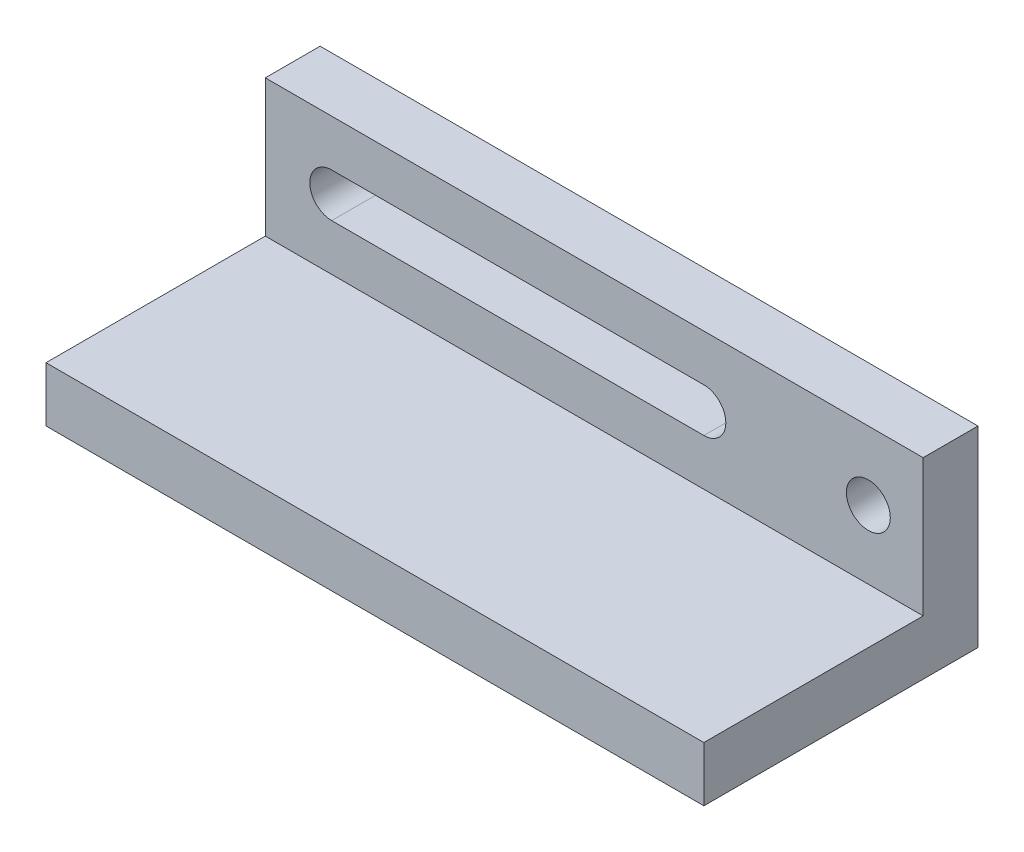
ISO-10303-21;
HEADER;
FILE_DESCRIPTION(('STEP AP214'),'2;1');
FILE_NAME('part.step','',(''),(''),'','','');
FILE_SCHEMA(('AUTOMOTIVE_DESIGN { 1 0 10303 214 1 1 1 1 }'));
ENDSEC;
DATA;
#1=APPLICATION_CONTEXT('core data for automotive mechanical design processes');
#2=APPLICATION_PROTOCOL_DEFINITION('international standard','automotive_design',2000,#1);
#3=PRODUCT_CONTEXT('',#1,'mechanical');
#4=PRODUCT('Part','Part','',(#3));
#5=PRODUCT_RELATED_PRODUCT_CATEGORY('part','',(#4));
#6=PRODUCT_DEFINITION_FORMATION('','',#4);
#7=PRODUCT_DEFINITION_CONTEXT('part definition',#1,'design');
#8=PRODUCT_DEFINITION('design','',#6,#7);
#9=PRODUCT_DEFINITION_SHAPE('','',#8);
#10=(LENGTH_UNIT() NAMED_UNIT(*) SI_UNIT(.MILLI.,.METRE.));
#11=(NAMED_UNIT(*) PLANE_ANGLE_UNIT() SI_UNIT($,.RADIAN.));
#12=(NAMED_UNIT(*) SI_UNIT($,.STERADIAN.) SOLID_ANGLE_UNIT());
#13=UNCERTAINTY_MEASURE_WITH_UNIT(LENGTH_MEASURE(1.E-05),#10,'distance_accuracy_value','');
#14=(GEOMETRIC_REPRESENTATION_CONTEXT(3) GLOBAL_UNCERTAINTY_ASSIGNED_CONTEXT((#13)) GLOBAL_UNIT_ASSIGNED_CONTEXT((#10,
#11,#12)) REPRESENTATION_CONTEXT('',''));
#15=CARTESIAN_POINT('',(0.,0.,0.));
#16=DIRECTION('',(0.,0.,1.));
#17=DIRECTION('',(1.,0.,0.));
#18=AXIS2_PLACEMENT_3D('',#15,#16,#17);
#19=CARTESIAN_POINT('',(0.,0.,10.));
#20=DIRECTION('',(0.,0.,-1.));
#21=DIRECTION('',(-1.,0.,0.));
#22=AXIS2_PLACEMENT_3D('',#19,#20,#21);
#23=PLANE('',#22);
#24=CARTESIAN_POINT('',(50.,0.,10.));
#25=DIRECTION('',(0.,0.,1.));
#26=DIRECTION('',(1.,0.,0.));
#27=AXIS2_PLACEMENT_3D('',#24,#25,#26);
#28=CIRCLE('',#27,4.00000000000001);
#29=CARTESIAN_POINT('',(54.,0.,10.));
#30=VERTEX_POINT('',#29);
#31=EDGE_CURVE('E181',#30,#30,#28,.T.);
#32=ORIENTED_EDGE('',*,*,#31,.F.);
#33=EDGE_LOOP('',(#32));
#34=FACE_BOUND('',#33,.T.);
#35=DIRECTION('',(0.,1.,0.));
#36=VECTOR('',#35,1.);
#37=CARTESIAN_POINT('',(60.,-12.5,10.));
#38=LINE('',#37,#36);
#39=CARTESIAN_POINT('',(60.,-12.5,10.));
#40=VERTEX_POINT('',#39);
#41=CARTESIAN_POINT('',(60.,12.5,10.));
#42=VERTEX_POINT('',#41);
#43=EDGE_CURVE('E190',#40,#42,#38,.T.);
#44=ORIENTED_EDGE('',*,*,#43,.T.);
#45=DIRECTION('',(-1.,0.,0.));
#46=VECTOR('',#45,1.);
#47=CARTESIAN_POINT('',(-60.,12.5,10.));
#48=LINE('',#47,#46);
#49=CARTESIAN_POINT('',(-60.,12.5,10.));
#50=VERTEX_POINT('',#49);
#51=EDGE_CURVE('E187',#42,#50,#48,.T.);
#52=ORIENTED_EDGE('',*,*,#51,.T.);
#53=DIRECTION('',(0.,-1.,0.));
#54=VECTOR('',#53,1.);
#55=CARTESIAN_POINT('',(-60.,-12.5,10.));
#56=LINE('',#55,#54);
#57=CARTESIAN_POINT('',(-60.,-12.5,10.));
#58=VERTEX_POINT('',#57);
#59=EDGE_CURVE('E189',#50,#58,#56,.T.);
#60=ORIENTED_EDGE('',*,*,#59,.T.);
#61=DIRECTION('',(1.,0.,0.));
#62=VECTOR('',#61,1.);
#63=CARTESIAN_POINT('',(-60.,-12.5,10.));
#64=LINE('',#63,#62);
#65=EDGE_CURVE('E118',#58,#40,#64,.T.);
#66=ORIENTED_EDGE('',*,*,#65,.T.);
#67=EDGE_LOOP('',(#44,#52,#60,#66));
#68=FACE_BOUND('',#67,.T.);
#69=CARTESIAN_POINT('',(-47.89,0.,10.));
#70=DIRECTION('',(0.,0.,1.));
#71=DIRECTION('',(1.,0.,0.));
#72=AXIS2_PLACEMENT_3D('',#69,#70,#71);
#73=CIRCLE('',#72,4.);
#74=CARTESIAN_POINT('',(-47.89,4.,10.));
#75=VERTEX_POINT('',#74);
#76=CARTESIAN_POINT('',(-47.89,-4.,10.));
#77=VERTEX_POINT('',#76);
#78=EDGE_CURVE('E155',#75,#77,#73,.T.);
#79=ORIENTED_EDGE('',*,*,#78,.F.);
#80=DIRECTION('',(-1.,0.,0.));
#81=VECTOR('',#80,1.);
#82=CARTESIAN_POINT('',(-47.89,4.,10.));
#83=LINE('',#82,#81);
#84=CARTESIAN_POINT('',(20.,4.,10.));
#85=VERTEX_POINT('',#84);
#86=EDGE_CURVE('E162',#85,#75,#83,.T.);
#87=ORIENTED_EDGE('',*,*,#86,.F.);
#88=CARTESIAN_POINT('',(20.,0.,10.));
#89=DIRECTION('',(0.,0.,1.));
#90=DIRECTION('',(1.,0.,0.));
#91=AXIS2_PLACEMENT_3D('',#88,#89,#90);
#92=CIRCLE('',#91,4.);
#93=CARTESIAN_POINT('',(20.,-4.,10.));
#94=VERTEX_POINT('',#93);
#95=EDGE_CURVE('E160',#94,#85,#92,.T.);
#96=ORIENTED_EDGE('',*,*,#95,.F.);
#97=DIRECTION('',(1.,0.,0.));
#98=VECTOR('',#97,1.);
#99=CARTESIAN_POINT('',(-47.89,-4.,10.));
#100=LINE('',#99,#98);
#101=EDGE_CURVE('E157',#77,#94,#100,.T.);
#102=ORIENTED_EDGE('',*,*,#101,.F.);
#103=EDGE_LOOP('',(#79,#87,#96,#102));
#104=FACE_BOUND('',#103,.T.);
#105=ADVANCED_FACE('F32',(#34,#68,#104),#23,.F.);
#106=CARTESIAN_POINT('',(0.,0.,0.));
#107=DIRECTION('',(0.,0.,-1.));
#108=DIRECTION('',(-1.,0.,0.));
#109=AXIS2_PLACEMENT_3D('',#106,#107,#108);
#110=PLANE('',#109);
#111=CARTESIAN_POINT('',(50.,0.,0.));
#112=DIRECTION('',(0.,0.,1.));
#113=DIRECTION('',(1.,0.,0.));
#114=AXIS2_PLACEMENT_3D('',#111,#112,#113);
#115=CIRCLE('',#114,4.00000000000001);
#116=CARTESIAN_POINT('',(54.,0.,0.));
#117=VERTEX_POINT('',#116);
#118=EDGE_CURVE('E180',#117,#117,#115,.T.);
#119=ORIENTED_EDGE('',*,*,#118,.T.);
#120=EDGE_LOOP('',(#119));
#121=FACE_BOUND('',#120,.T.);
#122=DIRECTION('',(0.,1.,0.));
#123=VECTOR('',#122,1.);
#124=CARTESIAN_POINT('',(60.,-12.5,0.));
#125=LINE('',#124,#123);
#126=CARTESIAN_POINT('',(60.,-22.5,0.));
#127=VERTEX_POINT('',#126);
#128=CARTESIAN_POINT('',(60.,12.5,0.));
#129=VERTEX_POINT('',#128);
#130=EDGE_CURVE('E184',#127,#129,#125,.T.);
#131=ORIENTED_EDGE('',*,*,#130,.F.);
#132=DIRECTION('',(-1.,0.,0.));
#133=VECTOR('',#132,1.);
#134=CARTESIAN_POINT('',(-60.,-22.5,0.));
#135=LINE('',#134,#133);
#136=CARTESIAN_POINT('',(-60.,-22.5,0.));
#137=VERTEX_POINT('',#136);
#138=EDGE_CURVE('E139',#127,#137,#135,.T.);
#139=ORIENTED_EDGE('',*,*,#138,.T.);
#140=DIRECTION('',(0.,-1.,0.));
#141=VECTOR('',#140,1.);
#142=CARTESIAN_POINT('',(-60.,-12.5,0.));
#143=LINE('',#142,#141);
#144=CARTESIAN_POINT('',(-60.,12.5,0.));
#145=VERTEX_POINT('',#144);
#146=EDGE_CURVE('E199',#145,#137,#143,.T.);
#147=ORIENTED_EDGE('',*,*,#146,.F.);
#148=DIRECTION('',(-1.,0.,0.));
#149=VECTOR('',#148,1.);
#150=CARTESIAN_POINT('',(-60.,12.5,0.));
#151=LINE('',#150,#149);
#152=EDGE_CURVE('E211',#129,#145,#151,.T.);
#153=ORIENTED_EDGE('',*,*,#152,.F.);
#154=EDGE_LOOP('',(#131,#139,#147,#153));
#155=FACE_BOUND('',#154,.T.);
#156=DIRECTION('',(-1.,0.,0.));
#157=VECTOR('',#156,1.);
#158=CARTESIAN_POINT('',(-47.89,4.,0.));
#159=LINE('',#158,#157);
#160=CARTESIAN_POINT('',(20.,4.,0.));
#161=VERTEX_POINT('',#160);
#162=CARTESIAN_POINT('',(-47.89,4.,0.));
#163=VERTEX_POINT('',#162);
#164=EDGE_CURVE('E158',#161,#163,#159,.T.);
#165=ORIENTED_EDGE('',*,*,#164,.T.);
#166=CARTESIAN_POINT('',(-47.89,0.,0.));
#167=DIRECTION('',(0.,0.,1.));
#168=DIRECTION('',(1.,0.,0.));
#169=AXIS2_PLACEMENT_3D('',#166,#167,#168);
#170=CIRCLE('',#169,4.);
#171=CARTESIAN_POINT('',(-47.89,-4.,0.));
#172=VERTEX_POINT('',#171);
#173=EDGE_CURVE('E57',#163,#172,#170,.T.);
#174=ORIENTED_EDGE('',*,*,#173,.T.);
#175=DIRECTION('',(1.,0.,0.));
#176=VECTOR('',#175,1.);
#177=CARTESIAN_POINT('',(-47.89,-4.,0.));
#178=LINE('',#177,#176);
#179=CARTESIAN_POINT('',(20.,-4.,0.));
#180=VERTEX_POINT('',#179);
#181=EDGE_CURVE('E166',#172,#180,#178,.T.);
#182=ORIENTED_EDGE('',*,*,#181,.T.);
#183=CARTESIAN_POINT('',(20.,0.,0.));
#184=DIRECTION('',(0.,0.,1.));
#185=DIRECTION('',(1.,0.,0.));
#186=AXIS2_PLACEMENT_3D('',#183,#184,#185);
#187=CIRCLE('',#186,4.);
#188=EDGE_CURVE('E169',#180,#161,#187,.T.);
#189=ORIENTED_EDGE('',*,*,#188,.T.);
#190=EDGE_LOOP('',(#165,#174,#182,#189));
#191=FACE_BOUND('',#190,.T.);
#192=ADVANCED_FACE('F209',(#121,#155,#191),#110,.T.);
#193=CARTESIAN_POINT('',(60.,-12.5,10.));
#194=DIRECTION('',(-1.,0.,0.));
#195=DIRECTION('',(0.,0.,1.));
#196=AXIS2_PLACEMENT_3D('',#193,#194,#195);
#197=PLANE('',#196);
#198=ORIENTED_EDGE('',*,*,#130,.T.);
#199=DIRECTION('',(0.,0.,-1.));
#200=VECTOR('',#199,1.);
#201=CARTESIAN_POINT('',(60.,12.5,10.));
#202=LINE('',#201,#200);
#203=EDGE_CURVE('E11',#42,#129,#202,.T.);
#204=ORIENTED_EDGE('',*,*,#203,.F.);
#205=ORIENTED_EDGE('',*,*,#43,.F.);
#206=DIRECTION('',(0.,0.,-1.));
#207=VECTOR('',#206,1.);
#208=CARTESIAN_POINT('',(60.,-12.5,50.));
#209=LINE('',#208,#207);
#210=CARTESIAN_POINT('',(60.,-12.5,50.));
#211=VERTEX_POINT('',#210);
#212=EDGE_CURVE('E123',#211,#40,#209,.T.);
#213=ORIENTED_EDGE('',*,*,#212,.F.);
#214=DIRECTION('',(0.,-1.,0.));
#215=VECTOR('',#214,1.);
#216=CARTESIAN_POINT('',(60.,-12.5,50.));
#217=LINE('',#216,#215);
#218=CARTESIAN_POINT('',(60.,-22.5,50.));
#219=VERTEX_POINT('',#218);
#220=EDGE_CURVE('E134',#211,#219,#217,.T.);
#221=ORIENTED_EDGE('',*,*,#220,.T.);
#222=DIRECTION('',(0.,0.,-1.));
#223=VECTOR('',#222,1.);
#224=CARTESIAN_POINT('',(60.,-22.5,50.));
#225=LINE('',#224,#223);
#226=EDGE_CURVE('E147',#219,#127,#225,.T.);
#227=ORIENTED_EDGE('',*,*,#226,.T.);
#228=EDGE_LOOP('',(#198,#204,#205,#213,#221,#227));
#229=FACE_BOUND('',#228,.T.);
#230=ADVANCED_FACE('F34',(#229),#197,.F.);
#231=CARTESIAN_POINT('',(-60.,12.5,10.));
#232=DIRECTION('',(0.,-1.,0.));
#233=DIRECTION('',(0.,0.,-1.));
#234=AXIS2_PLACEMENT_3D('',#231,#232,#233);
#235=PLANE('',#234);
#236=ORIENTED_EDGE('',*,*,#152,.T.);
#237=DIRECTION('',(0.,0.,-1.));
#238=VECTOR('',#237,1.);
#239=CARTESIAN_POINT('',(-60.,12.5,10.));
#240=LINE('',#239,#238);
#241=EDGE_CURVE('E41',#50,#145,#240,.T.);
#242=ORIENTED_EDGE('',*,*,#241,.F.);
#243=ORIENTED_EDGE('',*,*,#51,.F.);
#244=ORIENTED_EDGE('',*,*,#203,.T.);
#245=EDGE_LOOP('',(#236,#242,#243,#244));
#246=FACE_BOUND('',#245,.T.);
#247=ADVANCED_FACE('F242',(#246),#235,.F.);
#248=CARTESIAN_POINT('',(-60.,-12.5,10.));
#249=DIRECTION('',(1.,0.,0.));
#250=DIRECTION('',(0.,0.,-1.));
#251=AXIS2_PLACEMENT_3D('',#248,#249,#250);
#252=PLANE('',#251);
#253=ORIENTED_EDGE('',*,*,#146,.T.);
#254=DIRECTION('',(0.,0.,-1.));
#255=VECTOR('',#254,1.);
#256=CARTESIAN_POINT('',(-60.,-22.5,50.));
#257=LINE('',#256,#255);
#258=CARTESIAN_POINT('',(-60.,-22.5,50.));
#259=VERTEX_POINT('',#258);
#260=EDGE_CURVE('E138',#259,#137,#257,.T.);
#261=ORIENTED_EDGE('',*,*,#260,.F.);
#262=DIRECTION('',(0.,1.,0.));
#263=VECTOR('',#262,1.);
#264=CARTESIAN_POINT('',(-60.,-12.5,50.));
#265=LINE('',#264,#263);
#266=CARTESIAN_POINT('',(-60.,-12.5,50.));
#267=VERTEX_POINT('',#266);
#268=EDGE_CURVE('E131',#259,#267,#265,.T.);
#269=ORIENTED_EDGE('',*,*,#268,.T.);
#270=DIRECTION('',(0.,0.,-1.));
#271=VECTOR('',#270,1.);
#272=CARTESIAN_POINT('',(-60.,-12.5,50.));
#273=LINE('',#272,#271);
#274=EDGE_CURVE('E113',#267,#58,#273,.T.);
#275=ORIENTED_EDGE('',*,*,#274,.T.);
#276=ORIENTED_EDGE('',*,*,#59,.F.);
#277=ORIENTED_EDGE('',*,*,#241,.T.);
#278=EDGE_LOOP('',(#253,#261,#269,#275,#276,#277));
#279=FACE_BOUND('',#278,.T.);
#280=ADVANCED_FACE('F136',(#279),#252,.F.);
#281=CARTESIAN_POINT('',(50.,0.,10.));
#282=DIRECTION('',(0.,0.,-1.));
#283=DIRECTION('',(-1.,0.,0.));
#284=AXIS2_PLACEMENT_3D('',#281,#282,#283);
#285=CYLINDRICAL_SURFACE('',#284,4.00000000000001);
#286=ORIENTED_EDGE('',*,*,#31,.T.);
#287=EDGE_LOOP('',(#286));
#288=FACE_BOUND('',#287,.T.);
#289=ORIENTED_EDGE('',*,*,#118,.F.);
#290=EDGE_LOOP('',(#289));
#291=FACE_BOUND('',#290,.T.);
#292=ADVANCED_FACE('F238',(#288,#291),#285,.F.);
#293=CARTESIAN_POINT('',(-47.89,0.,10.));
#294=DIRECTION('',(0.,0.,-1.));
#295=DIRECTION('',(-1.,0.,0.));
#296=AXIS2_PLACEMENT_3D('',#293,#294,#295);
#297=CYLINDRICAL_SURFACE('',#296,4.);
#298=ORIENTED_EDGE('',*,*,#173,.F.);
#299=DIRECTION('',(0.,0.,-1.));
#300=VECTOR('',#299,1.);
#301=CARTESIAN_POINT('',(-47.89,4.,10.));
#302=LINE('',#301,#300);
#303=EDGE_CURVE('E164',#75,#163,#302,.T.);
#304=ORIENTED_EDGE('',*,*,#303,.F.);
#305=ORIENTED_EDGE('',*,*,#78,.T.);
#306=DIRECTION('',(0.,0.,-1.));
#307=VECTOR('',#306,1.);
#308=CARTESIAN_POINT('',(-47.89,-4.,10.));
#309=LINE('',#308,#307);
#310=EDGE_CURVE('E178',#77,#172,#309,.T.);
#311=ORIENTED_EDGE('',*,*,#310,.T.);
#312=EDGE_LOOP('',(#298,#304,#305,#311));
#313=FACE_BOUND('',#312,.T.);
#314=ADVANCED_FACE('F287',(#313),#297,.F.);
#315=CARTESIAN_POINT('',(-47.89,-4.,10.));
#316=DIRECTION('',(0.,1.,0.));
#317=DIRECTION('',(0.,0.,1.));
#318=AXIS2_PLACEMENT_3D('',#315,#316,#317);
#319=PLANE('',#318);
#320=ORIENTED_EDGE('',*,*,#181,.F.);
#321=ORIENTED_EDGE('',*,*,#310,.F.);
#322=ORIENTED_EDGE('',*,*,#101,.T.);
#323=DIRECTION('',(0.,0.,-1.));
#324=VECTOR('',#323,1.);
#325=CARTESIAN_POINT('',(20.,-4.,10.));
#326=LINE('',#325,#324);
#327=EDGE_CURVE('E176',#94,#180,#326,.T.);
#328=ORIENTED_EDGE('',*,*,#327,.T.);
#329=EDGE_LOOP('',(#320,#321,#322,#328));
#330=FACE_BOUND('',#329,.T.);
#331=ADVANCED_FACE('F277',(#330),#319,.T.);
#332=CARTESIAN_POINT('',(20.,0.,10.));
#333=DIRECTION('',(0.,0.,-1.));
#334=DIRECTION('',(-1.,0.,0.));
#335=AXIS2_PLACEMENT_3D('',#332,#333,#334);
#336=CYLINDRICAL_SURFACE('',#335,4.);
#337=ORIENTED_EDGE('',*,*,#188,.F.);
#338=ORIENTED_EDGE('',*,*,#327,.F.);
#339=ORIENTED_EDGE('',*,*,#95,.T.);
#340=DIRECTION('',(0.,0.,-1.));
#341=VECTOR('',#340,1.);
#342=CARTESIAN_POINT('',(20.,4.,10.));
#343=LINE('',#342,#341);
#344=EDGE_CURVE('E49',#85,#161,#343,.T.);
#345=ORIENTED_EDGE('',*,*,#344,.T.);
#346=EDGE_LOOP('',(#337,#338,#339,#345));
#347=FACE_BOUND('',#346,.T.);
#348=ADVANCED_FACE('F268',(#347),#336,.F.);
#349=CARTESIAN_POINT('',(-47.89,4.,10.));
#350=DIRECTION('',(0.,-1.,0.));
#351=DIRECTION('',(0.,0.,-1.));
#352=AXIS2_PLACEMENT_3D('',#349,#350,#351);
#353=PLANE('',#352);
#354=ORIENTED_EDGE('',*,*,#164,.F.);
#355=ORIENTED_EDGE('',*,*,#344,.F.);
#356=ORIENTED_EDGE('',*,*,#86,.T.);
#357=ORIENTED_EDGE('',*,*,#303,.T.);
#358=EDGE_LOOP('',(#354,#355,#356,#357));
#359=FACE_BOUND('',#358,.T.);
#360=ADVANCED_FACE('F226',(#359),#353,.T.);
#361=CARTESIAN_POINT('',(-60.,-12.5,50.));
#362=DIRECTION('',(0.,1.,0.));
#363=DIRECTION('',(-1.,0.,0.));
#364=AXIS2_PLACEMENT_3D('',#361,#362,#363);
#365=PLANE('',#364);
#366=ORIENTED_EDGE('',*,*,#65,.F.);
#367=ORIENTED_EDGE('',*,*,#274,.F.);
#368=DIRECTION('',(1.,0.,0.));
#369=VECTOR('',#368,1.);
#370=CARTESIAN_POINT('',(-60.,-12.5,50.));
#371=LINE('',#370,#369);
#372=EDGE_CURVE('E116',#267,#211,#371,.T.);
#373=ORIENTED_EDGE('',*,*,#372,.T.);
#374=ORIENTED_EDGE('',*,*,#212,.T.);
#375=EDGE_LOOP('',(#366,#367,#373,#374));
#376=FACE_BOUND('',#375,.T.);
#377=ADVANCED_FACE('F115',(#376),#365,.T.);
#378=CARTESIAN_POINT('',(-60.,-22.5,50.));
#379=DIRECTION('',(0.,-1.,0.));
#380=DIRECTION('',(1.,0.,0.));
#381=AXIS2_PLACEMENT_3D('',#378,#379,#380);
#382=PLANE('',#381);
#383=ORIENTED_EDGE('',*,*,#138,.F.);
#384=ORIENTED_EDGE('',*,*,#226,.F.);
#385=DIRECTION('',(-1.,0.,0.));
#386=VECTOR('',#385,1.);
#387=CARTESIAN_POINT('',(-60.,-22.5,50.));
#388=LINE('',#387,#386);
#389=EDGE_CURVE('E124',#219,#259,#388,.T.);
#390=ORIENTED_EDGE('',*,*,#389,.T.);
#391=ORIENTED_EDGE('',*,*,#260,.T.);
#392=EDGE_LOOP('',(#383,#384,#390,#391));
#393=FACE_BOUND('',#392,.T.);
#394=ADVANCED_FACE('F218',(#393),#382,.T.);
#395=CARTESIAN_POINT('',(0.,0.,50.));
#396=DIRECTION('',(0.,0.,1.));
#397=DIRECTION('',(1.,0.,0.));
#398=AXIS2_PLACEMENT_3D('',#395,#396,#397);
#399=PLANE('',#398);
#400=ORIENTED_EDGE('',*,*,#268,.F.);
#401=ORIENTED_EDGE('',*,*,#389,.F.);
#402=ORIENTED_EDGE('',*,*,#220,.F.);
#403=ORIENTED_EDGE('',*,*,#372,.F.);
#404=EDGE_LOOP('',(#400,#401,#402,#403));
#405=FACE_BOUND('',#404,.T.);
#406=ADVANCED_FACE('F129',(#405),#399,.T.);
#407=CLOSED_SHELL('',(#105,#192,#230,#247,#280,#292,#314,#331,#348,#360,#377,#394,#406));
#408=MANIFOLD_SOLID_BREP('B2',#407);
#409=ADVANCED_BREP_SHAPE_REPRESENTATION('',(#18,#408),#14);
#410=SHAPE_DEFINITION_REPRESENTATION(#9,#409);
ENDSEC;
END-ISO-10303-21;
